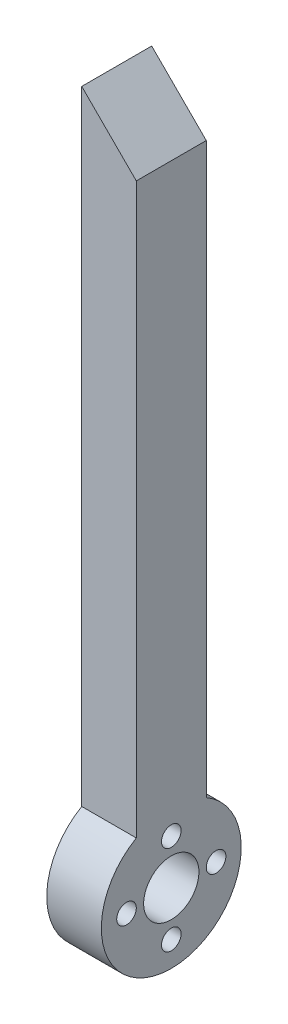
ISO-10303-21;
HEADER;
FILE_DESCRIPTION(('STEP AP214'),'2;1');
FILE_NAME('part.step','',(''),(''),'','','');
FILE_SCHEMA(('AUTOMOTIVE_DESIGN { 1 0 10303 214 1 1 1 1 }'));
ENDSEC;
DATA;
#1=APPLICATION_CONTEXT('core data for automotive mechanical design processes');
#2=APPLICATION_PROTOCOL_DEFINITION('international standard','automotive_design',2000,#1);
#3=PRODUCT_CONTEXT('',#1,'mechanical');
#4=PRODUCT('Part','Part','',(#3));
#5=PRODUCT_RELATED_PRODUCT_CATEGORY('part','',(#4));
#6=PRODUCT_DEFINITION_FORMATION('','',#4);
#7=PRODUCT_DEFINITION_CONTEXT('part definition',#1,'design');
#8=PRODUCT_DEFINITION('design','',#6,#7);
#9=PRODUCT_DEFINITION_SHAPE('','',#8);
#10=(LENGTH_UNIT() NAMED_UNIT(*) SI_UNIT(.MILLI.,.METRE.));
#11=(NAMED_UNIT(*) PLANE_ANGLE_UNIT() SI_UNIT($,.RADIAN.));
#12=(NAMED_UNIT(*) SI_UNIT($,.STERADIAN.) SOLID_ANGLE_UNIT());
#13=UNCERTAINTY_MEASURE_WITH_UNIT(LENGTH_MEASURE(1.E-05),#10,'distance_accuracy_value','');
#14=(GEOMETRIC_REPRESENTATION_CONTEXT(3) GLOBAL_UNCERTAINTY_ASSIGNED_CONTEXT((#13)) GLOBAL_UNIT_ASSIGNED_CONTEXT((#10,
#11,#12)) REPRESENTATION_CONTEXT('',''));
#15=CARTESIAN_POINT('',(0.,0.,0.));
#16=DIRECTION('',(0.,0.,1.));
#17=DIRECTION('',(1.,0.,0.));
#18=AXIS2_PLACEMENT_3D('',#15,#16,#17);
#19=CARTESIAN_POINT('',(9.906,-61.7985226280624,0.));
#20=DIRECTION('',(1.,0.,0.));
#21=DIRECTION('',(0.,0.,-1.));
#22=AXIS2_PLACEMENT_3D('',#19,#20,#21);
#23=PLANE('',#22);
#24=CARTESIAN_POINT('',(9.906,-53.6705226280624,0.));
#25=DIRECTION('',(1.,0.,0.));
#26=DIRECTION('',(0.,0.,-1.));
#27=AXIS2_PLACEMENT_3D('',#24,#25,#26);
#28=CIRCLE('',#27,1.778);
#29=CARTESIAN_POINT('',(9.906,-53.6705226280624,-1.778));
#30=VERTEX_POINT('',#29);
#31=EDGE_CURVE('E122',#30,#30,#28,.T.);
#32=ORIENTED_EDGE('',*,*,#31,.F.);
#33=EDGE_LOOP('',(#32));
#34=FACE_BOUND('',#33,.T.);
#35=CARTESIAN_POINT('',(9.906,-61.7985226280624,8.128));
#36=DIRECTION('',(1.,0.,0.));
#37=DIRECTION('',(0.,0.,-1.));
#38=AXIS2_PLACEMENT_3D('',#35,#36,#37);
#39=CIRCLE('',#38,1.778);
#40=CARTESIAN_POINT('',(9.906,-61.7985226280624,6.35));
#41=VERTEX_POINT('',#40);
#42=EDGE_CURVE('E138',#41,#41,#39,.T.);
#43=ORIENTED_EDGE('',*,*,#42,.F.);
#44=EDGE_LOOP('',(#43));
#45=FACE_BOUND('',#44,.T.);
#46=DIRECTION('',(0.,1.,0.));
#47=VECTOR('',#46,1.);
#48=CARTESIAN_POINT('',(9.906,-50.8,-6.35));
#49=LINE('',#48,#47);
#50=CARTESIAN_POINT('',(9.906,-50.8,-6.35000000000001));
#51=VERTEX_POINT('',#50);
#52=CARTESIAN_POINT('',(9.906,52.5014773719376,-6.35));
#53=VERTEX_POINT('',#52);
#54=EDGE_CURVE('E93',#51,#53,#49,.T.);
#55=ORIENTED_EDGE('',*,*,#54,.T.);
#56=DIRECTION('',(0.,0.,1.));
#57=VECTOR('',#56,1.);
#58=CARTESIAN_POINT('',(9.906,52.5014773719376,6.35));
#59=LINE('',#58,#57);
#60=CARTESIAN_POINT('',(9.906,52.5014773719376,6.35));
#61=VERTEX_POINT('',#60);
#62=EDGE_CURVE('E88',#53,#61,#59,.T.);
#63=ORIENTED_EDGE('',*,*,#62,.T.);
#64=DIRECTION('',(0.,-1.,0.));
#65=VECTOR('',#64,1.);
#66=CARTESIAN_POINT('',(9.906,-50.8,6.35));
#67=LINE('',#66,#65);
#68=CARTESIAN_POINT('',(9.906,-50.8,6.35));
#69=VERTEX_POINT('',#68);
#70=EDGE_CURVE('E91',#61,#69,#67,.T.);
#71=ORIENTED_EDGE('',*,*,#70,.T.);
#72=CARTESIAN_POINT('',(9.906,-61.7985226280624,0.));
#73=DIRECTION('',(1.,0.,0.));
#74=DIRECTION('',(0.,0.,-1.));
#75=AXIS2_PLACEMENT_3D('',#72,#73,#74);
#76=CIRCLE('',#75,12.7);
#77=EDGE_CURVE('E60',#69,#51,#76,.T.);
#78=ORIENTED_EDGE('',*,*,#77,.T.);
#79=EDGE_LOOP('',(#55,#63,#71,#78));
#80=FACE_BOUND('',#79,.T.);
#81=CARTESIAN_POINT('',(9.906,-61.7985226280624,0.));
#82=DIRECTION('',(1.,0.,0.));
#83=DIRECTION('',(0.,0.,-1.));
#84=AXIS2_PLACEMENT_3D('',#81,#82,#83);
#85=CIRCLE('',#84,5.0165);
#86=CARTESIAN_POINT('',(9.906,-61.7985226280624,-5.0165));
#87=VERTEX_POINT('',#86);
#88=EDGE_CURVE('E146',#87,#87,#85,.T.);
#89=ORIENTED_EDGE('',*,*,#88,.F.);
#90=EDGE_LOOP('',(#89));
#91=FACE_BOUND('',#90,.T.);
#92=CARTESIAN_POINT('',(9.906,-61.7985226280624,-8.128));
#93=DIRECTION('',(1.,0.,0.));
#94=DIRECTION('',(0.,0.,-1.));
#95=AXIS2_PLACEMENT_3D('',#92,#93,#94);
#96=CIRCLE('',#95,1.778);
#97=CARTESIAN_POINT('',(9.906,-61.7985226280624,-9.906));
#98=VERTEX_POINT('',#97);
#99=EDGE_CURVE('E130',#98,#98,#96,.T.);
#100=ORIENTED_EDGE('',*,*,#99,.F.);
#101=EDGE_LOOP('',(#100));
#102=FACE_BOUND('',#101,.T.);
#103=CARTESIAN_POINT('',(9.906,-69.9265226280624,0.));
#104=DIRECTION('',(1.,0.,0.));
#105=DIRECTION('',(0.,0.,-1.));
#106=AXIS2_PLACEMENT_3D('',#103,#104,#105);
#107=CIRCLE('',#106,1.778);
#108=CARTESIAN_POINT('',(9.906,-69.9265226280624,-1.778));
#109=VERTEX_POINT('',#108);
#110=EDGE_CURVE('E113',#109,#109,#107,.T.);
#111=ORIENTED_EDGE('',*,*,#110,.F.);
#112=EDGE_LOOP('',(#111));
#113=FACE_BOUND('',#112,.T.);
#114=ADVANCED_FACE('F42',(#34,#45,#80,#91,#102,#113),#23,.T.);
#115=CARTESIAN_POINT('',(0.,-61.7985226280624,0.));
#116=DIRECTION('',(1.,0.,0.));
#117=DIRECTION('',(0.,0.,-1.));
#118=AXIS2_PLACEMENT_3D('',#115,#116,#117);
#119=PLANE('',#118);
#120=DIRECTION('',(0.,1.,0.));
#121=VECTOR('',#120,1.);
#122=CARTESIAN_POINT('',(0.,-50.8,-6.35));
#123=LINE('',#122,#121);
#124=CARTESIAN_POINT('',(0.,-50.8,-6.35000000000001));
#125=VERTEX_POINT('',#124);
#126=CARTESIAN_POINT('',(0.,62.4074773719375,-6.35));
#127=VERTEX_POINT('',#126);
#128=EDGE_CURVE('E82',#125,#127,#123,.T.);
#129=ORIENTED_EDGE('',*,*,#128,.F.);
#130=CARTESIAN_POINT('',(0.,-61.7985226280624,0.));
#131=DIRECTION('',(1.,0.,0.));
#132=DIRECTION('',(0.,0.,-1.));
#133=AXIS2_PLACEMENT_3D('',#130,#131,#132);
#134=CIRCLE('',#133,12.7);
#135=CARTESIAN_POINT('',(0.,-50.8,6.35));
#136=VERTEX_POINT('',#135);
#137=EDGE_CURVE('E154',#136,#125,#134,.T.);
#138=ORIENTED_EDGE('',*,*,#137,.F.);
#139=DIRECTION('',(0.,-1.,0.));
#140=VECTOR('',#139,1.);
#141=CARTESIAN_POINT('',(0.,-50.8,6.35));
#142=LINE('',#141,#140);
#143=CARTESIAN_POINT('',(0.,62.4074773719375,6.35));
#144=VERTEX_POINT('',#143);
#145=EDGE_CURVE('E72',#144,#136,#142,.T.);
#146=ORIENTED_EDGE('',*,*,#145,.F.);
#147=DIRECTION('',(0.,0.,1.));
#148=VECTOR('',#147,1.);
#149=CARTESIAN_POINT('',(0.,62.4074773719375,-20.3591995488678));
#150=LINE('',#149,#148);
#151=EDGE_CURVE('E105',#127,#144,#150,.T.);
#152=ORIENTED_EDGE('',*,*,#151,.F.);
#153=EDGE_LOOP('',(#129,#138,#146,#152));
#154=FACE_BOUND('',#153,.T.);
#155=CARTESIAN_POINT('',(0.,-61.7985226280624,0.));
#156=DIRECTION('',(1.,0.,0.));
#157=DIRECTION('',(0.,0.,-1.));
#158=AXIS2_PLACEMENT_3D('',#155,#156,#157);
#159=CIRCLE('',#158,5.0165);
#160=CARTESIAN_POINT('',(0.,-61.7985226280624,-5.0165));
#161=VERTEX_POINT('',#160);
#162=EDGE_CURVE('E142',#161,#161,#159,.T.);
#163=ORIENTED_EDGE('',*,*,#162,.T.);
#164=EDGE_LOOP('',(#163));
#165=FACE_BOUND('',#164,.T.);
#166=CARTESIAN_POINT('',(0.,-61.7985226280624,8.128));
#167=DIRECTION('',(1.,0.,0.));
#168=DIRECTION('',(0.,0.,-1.));
#169=AXIS2_PLACEMENT_3D('',#166,#167,#168);
#170=CIRCLE('',#169,1.778);
#171=CARTESIAN_POINT('',(0.,-61.7985226280624,6.35));
#172=VERTEX_POINT('',#171);
#173=EDGE_CURVE('E134',#172,#172,#170,.T.);
#174=ORIENTED_EDGE('',*,*,#173,.T.);
#175=EDGE_LOOP('',(#174));
#176=FACE_BOUND('',#175,.T.);
#177=CARTESIAN_POINT('',(0.,-61.7985226280624,-8.128));
#178=DIRECTION('',(1.,0.,0.));
#179=DIRECTION('',(0.,0.,-1.));
#180=AXIS2_PLACEMENT_3D('',#177,#178,#179);
#181=CIRCLE('',#180,1.778);
#182=CARTESIAN_POINT('',(0.,-61.7985226280624,-9.906));
#183=VERTEX_POINT('',#182);
#184=EDGE_CURVE('E126',#183,#183,#181,.T.);
#185=ORIENTED_EDGE('',*,*,#184,.T.);
#186=EDGE_LOOP('',(#185));
#187=FACE_BOUND('',#186,.T.);
#188=CARTESIAN_POINT('',(0.,-53.6705226280624,0.));
#189=DIRECTION('',(1.,0.,0.));
#190=DIRECTION('',(0.,0.,-1.));
#191=AXIS2_PLACEMENT_3D('',#188,#189,#190);
#192=CIRCLE('',#191,1.778);
#193=CARTESIAN_POINT('',(0.,-53.6705226280624,-1.778));
#194=VERTEX_POINT('',#193);
#195=EDGE_CURVE('E117',#194,#194,#192,.T.);
#196=ORIENTED_EDGE('',*,*,#195,.T.);
#197=EDGE_LOOP('',(#196));
#198=FACE_BOUND('',#197,.T.);
#199=CARTESIAN_POINT('',(0.,-69.9265226280624,0.));
#200=DIRECTION('',(1.,0.,0.));
#201=DIRECTION('',(0.,0.,-1.));
#202=AXIS2_PLACEMENT_3D('',#199,#200,#201);
#203=CIRCLE('',#202,1.778);
#204=CARTESIAN_POINT('',(0.,-69.9265226280624,-1.778));
#205=VERTEX_POINT('',#204);
#206=EDGE_CURVE('E118',#205,#205,#203,.T.);
#207=ORIENTED_EDGE('',*,*,#206,.T.);
#208=EDGE_LOOP('',(#207));
#209=FACE_BOUND('',#208,.T.);
#210=ADVANCED_FACE('F167',(#154,#165,#176,#187,#198,#209),#119,.F.);
#211=CARTESIAN_POINT('',(9.906,-50.8,-6.35));
#212=DIRECTION('',(0.,0.,1.));
#213=DIRECTION('',(0.,-1.,0.));
#214=AXIS2_PLACEMENT_3D('',#211,#212,#213);
#215=PLANE('',#214);
#216=ORIENTED_EDGE('',*,*,#128,.T.);
#217=DIRECTION('',(0.707106781186551,-0.707106781186544,0.));
#218=VECTOR('',#217,1.);
#219=CARTESIAN_POINT('',(9.906,52.5014773719376,-6.35));
#220=LINE('',#219,#218);
#221=EDGE_CURVE('E109',#127,#53,#220,.T.);
#222=ORIENTED_EDGE('',*,*,#221,.T.);
#223=ORIENTED_EDGE('',*,*,#54,.F.);
#224=DIRECTION('',(-1.,0.,0.));
#225=VECTOR('',#224,1.);
#226=CARTESIAN_POINT('',(9.906,-50.8,-6.35000000000001));
#227=LINE('',#226,#225);
#228=EDGE_CURVE('E52',#51,#125,#227,.T.);
#229=ORIENTED_EDGE('',*,*,#228,.T.);
#230=EDGE_LOOP('',(#216,#222,#223,#229));
#231=FACE_BOUND('',#230,.T.);
#232=ADVANCED_FACE('F44',(#231),#215,.F.);
#233=CARTESIAN_POINT('',(9.906,-50.8,6.35));
#234=DIRECTION('',(0.,0.,-1.));
#235=DIRECTION('',(-1.,0.,0.));
#236=AXIS2_PLACEMENT_3D('',#233,#234,#235);
#237=PLANE('',#236);
#238=ORIENTED_EDGE('',*,*,#145,.T.);
#239=DIRECTION('',(-1.,0.,0.));
#240=VECTOR('',#239,1.);
#241=CARTESIAN_POINT('',(9.906,-50.8,6.35));
#242=LINE('',#241,#240);
#243=EDGE_CURVE('E11',#69,#136,#242,.T.);
#244=ORIENTED_EDGE('',*,*,#243,.F.);
#245=ORIENTED_EDGE('',*,*,#70,.F.);
#246=DIRECTION('',(-0.707106781186551,0.707106781186544,0.));
#247=VECTOR('',#246,1.);
#248=CARTESIAN_POINT('',(9.906,52.5014773719376,6.35));
#249=LINE('',#248,#247);
#250=EDGE_CURVE('E99',#61,#144,#249,.T.);
#251=ORIENTED_EDGE('',*,*,#250,.T.);
#252=EDGE_LOOP('',(#238,#244,#245,#251));
#253=FACE_BOUND('',#252,.T.);
#254=ADVANCED_FACE('F98',(#253),#237,.F.);
#255=CARTESIAN_POINT('',(9.906,-61.7985226280624,0.));
#256=DIRECTION('',(-1.,0.,0.));
#257=DIRECTION('',(0.,0.,1.));
#258=AXIS2_PLACEMENT_3D('',#255,#256,#257);
#259=CYLINDRICAL_SURFACE('',#258,12.7);
#260=ORIENTED_EDGE('',*,*,#137,.T.);
#261=ORIENTED_EDGE('',*,*,#228,.F.);
#262=ORIENTED_EDGE('',*,*,#77,.F.);
#263=ORIENTED_EDGE('',*,*,#243,.T.);
#264=EDGE_LOOP('',(#260,#261,#262,#263));
#265=FACE_BOUND('',#264,.T.);
#266=ADVANCED_FACE('F169',(#265),#259,.T.);
#267=CARTESIAN_POINT('',(9.906,-61.7985226280624,0.));
#268=DIRECTION('',(-1.,0.,0.));
#269=DIRECTION('',(0.,0.,1.));
#270=AXIS2_PLACEMENT_3D('',#267,#268,#269);
#271=CYLINDRICAL_SURFACE('',#270,5.0165);
#272=ORIENTED_EDGE('',*,*,#88,.T.);
#273=EDGE_LOOP('',(#272));
#274=FACE_BOUND('',#273,.T.);
#275=ORIENTED_EDGE('',*,*,#162,.F.);
#276=EDGE_LOOP('',(#275));
#277=FACE_BOUND('',#276,.T.);
#278=ADVANCED_FACE('F171',(#274,#277),#271,.F.);
#279=CARTESIAN_POINT('',(9.906,-61.7985226280624,8.128));
#280=DIRECTION('',(-1.,0.,0.));
#281=DIRECTION('',(0.,0.,1.));
#282=AXIS2_PLACEMENT_3D('',#279,#280,#281);
#283=CYLINDRICAL_SURFACE('',#282,1.778);
#284=ORIENTED_EDGE('',*,*,#42,.T.);
#285=EDGE_LOOP('',(#284));
#286=FACE_BOUND('',#285,.T.);
#287=ORIENTED_EDGE('',*,*,#173,.F.);
#288=EDGE_LOOP('',(#287));
#289=FACE_BOUND('',#288,.T.);
#290=ADVANCED_FACE('F177',(#286,#289),#283,.F.);
#291=CARTESIAN_POINT('',(9.906,-61.7985226280624,-8.128));
#292=DIRECTION('',(-1.,0.,0.));
#293=DIRECTION('',(0.,0.,1.));
#294=AXIS2_PLACEMENT_3D('',#291,#292,#293);
#295=CYLINDRICAL_SURFACE('',#294,1.778);
#296=ORIENTED_EDGE('',*,*,#99,.T.);
#297=EDGE_LOOP('',(#296));
#298=FACE_BOUND('',#297,.T.);
#299=ORIENTED_EDGE('',*,*,#184,.F.);
#300=EDGE_LOOP('',(#299));
#301=FACE_BOUND('',#300,.T.);
#302=ADVANCED_FACE('F192',(#298,#301),#295,.F.);
#303=CARTESIAN_POINT('',(9.906,-53.6705226280624,0.));
#304=DIRECTION('',(-1.,0.,0.));
#305=DIRECTION('',(0.,0.,1.));
#306=AXIS2_PLACEMENT_3D('',#303,#304,#305);
#307=CYLINDRICAL_SURFACE('',#306,1.778);
#308=ORIENTED_EDGE('',*,*,#31,.T.);
#309=EDGE_LOOP('',(#308));
#310=FACE_BOUND('',#309,.T.);
#311=ORIENTED_EDGE('',*,*,#195,.F.);
#312=EDGE_LOOP('',(#311));
#313=FACE_BOUND('',#312,.T.);
#314=ADVANCED_FACE('F196',(#310,#313),#307,.F.);
#315=CARTESIAN_POINT('',(9.906,-69.9265226280624,0.));
#316=DIRECTION('',(-1.,0.,0.));
#317=DIRECTION('',(0.,0.,1.));
#318=AXIS2_PLACEMENT_3D('',#315,#316,#317);
#319=CYLINDRICAL_SURFACE('',#318,1.778);
#320=ORIENTED_EDGE('',*,*,#110,.T.);
#321=EDGE_LOOP('',(#320));
#322=FACE_BOUND('',#321,.T.);
#323=ORIENTED_EDGE('',*,*,#206,.F.);
#324=EDGE_LOOP('',(#323));
#325=FACE_BOUND('',#324,.T.);
#326=ADVANCED_FACE('F200',(#322,#325),#319,.F.);
#327=CARTESIAN_POINT('',(9.906,52.5014773719376,-20.3591995488678));
#328=DIRECTION('',(0.707106781186544,0.707106781186551,0.));
#329=DIRECTION('',(-0.707106781186551,0.707106781186544,0.));
#330=AXIS2_PLACEMENT_3D('',#327,#328,#329);
#331=PLANE('',#330);
#332=ORIENTED_EDGE('',*,*,#221,.F.);
#333=ORIENTED_EDGE('',*,*,#151,.T.);
#334=ORIENTED_EDGE('',*,*,#250,.F.);
#335=ORIENTED_EDGE('',*,*,#62,.F.);
#336=EDGE_LOOP('',(#332,#333,#334,#335));
#337=FACE_BOUND('',#336,.T.);
#338=ADVANCED_FACE('F103',(#337),#331,.T.);
#339=CLOSED_SHELL('',(#114,#210,#232,#254,#266,#278,#290,#302,#314,#326,#338));
#340=MANIFOLD_SOLID_BREP('B2',#339);
#341=ADVANCED_BREP_SHAPE_REPRESENTATION('',(#18,#340),#14);
#342=SHAPE_DEFINITION_REPRESENTATION(#9,#341);
ENDSEC;
END-ISO-10303-21;
